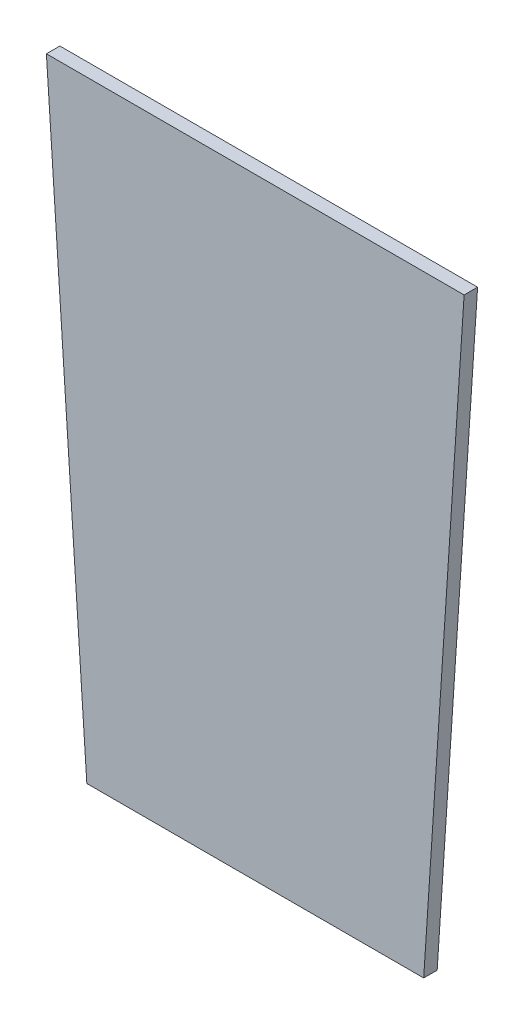
ISO-10303-21;
HEADER;
FILE_DESCRIPTION(('STEP AP214'),'2;1');
FILE_NAME('part.step','',(''),(''),'','','');
FILE_SCHEMA(('AUTOMOTIVE_DESIGN { 1 0 10303 214 1 1 1 1 }'));
ENDSEC;
DATA;
#1=APPLICATION_CONTEXT('core data for automotive mechanical design processes');
#2=APPLICATION_PROTOCOL_DEFINITION('international standard','automotive_design',2000,#1);
#3=PRODUCT_CONTEXT('',#1,'mechanical');
#4=PRODUCT('Part','Part','',(#3));
#5=PRODUCT_RELATED_PRODUCT_CATEGORY('part','',(#4));
#6=PRODUCT_DEFINITION_FORMATION('','',#4);
#7=PRODUCT_DEFINITION_CONTEXT('part definition',#1,'design');
#8=PRODUCT_DEFINITION('design','',#6,#7);
#9=PRODUCT_DEFINITION_SHAPE('','',#8);
#10=(LENGTH_UNIT() NAMED_UNIT(*) SI_UNIT(.MILLI.,.METRE.));
#11=(NAMED_UNIT(*) PLANE_ANGLE_UNIT() SI_UNIT($,.RADIAN.));
#12=(NAMED_UNIT(*) SI_UNIT($,.STERADIAN.) SOLID_ANGLE_UNIT());
#13=UNCERTAINTY_MEASURE_WITH_UNIT(LENGTH_MEASURE(1.E-05),#10,'distance_accuracy_value','');
#14=(GEOMETRIC_REPRESENTATION_CONTEXT(3) GLOBAL_UNCERTAINTY_ASSIGNED_CONTEXT((#13)) GLOBAL_UNIT_ASSIGNED_CONTEXT((#10,
#11,#12)) REPRESENTATION_CONTEXT('',''));
#15=CARTESIAN_POINT('',(0.,0.,0.));
#16=DIRECTION('',(0.,0.,1.));
#17=DIRECTION('',(1.,0.,0.));
#18=AXIS2_PLACEMENT_3D('',#15,#16,#17);
#19=CARTESIAN_POINT('',(-125.,-227.004955893038,10.));
#20=DIRECTION('',(0.997823981947419,0.0659340659340659,0.));
#21=DIRECTION('',(-0.0659340659340659,0.997823981947419,0.));
#22=AXIS2_PLACEMENT_3D('',#19,#20,#21);
#23=PLANE('',#22);
#24=DIRECTION('',(0.0659340659340659,-0.997823981947419,0.));
#25=VECTOR('',#24,1.);
#26=CARTESIAN_POINT('',(-125.,-227.004955893038,0.));
#27=LINE('',#26,#25);
#28=CARTESIAN_POINT('',(-155.,227.004955893038,0.));
#29=VERTEX_POINT('',#28);
#30=CARTESIAN_POINT('',(-125.,-227.004955893038,0.));
#31=VERTEX_POINT('',#30);
#32=EDGE_CURVE('E119',#29,#31,#27,.T.);
#33=ORIENTED_EDGE('',*,*,#32,.T.);
#34=DIRECTION('',(0.,0.,-1.));
#35=VECTOR('',#34,1.);
#36=CARTESIAN_POINT('',(-125.,-227.004955893038,10.));
#37=LINE('',#36,#35);
#38=CARTESIAN_POINT('',(-125.,-227.004955893038,10.));
#39=VERTEX_POINT('',#38);
#40=EDGE_CURVE('E11',#39,#31,#37,.T.);
#41=ORIENTED_EDGE('',*,*,#40,.F.);
#42=DIRECTION('',(0.0659340659340659,-0.997823981947419,0.));
#43=VECTOR('',#42,1.);
#44=CARTESIAN_POINT('',(-125.,-227.004955893038,10.));
#45=LINE('',#44,#43);
#46=CARTESIAN_POINT('',(-155.,227.004955893038,10.));
#47=VERTEX_POINT('',#46);
#48=EDGE_CURVE('E102',#47,#39,#45,.T.);
#49=ORIENTED_EDGE('',*,*,#48,.F.);
#50=DIRECTION('',(0.,0.,-1.));
#51=VECTOR('',#50,1.);
#52=CARTESIAN_POINT('',(-155.,227.004955893038,10.));
#53=LINE('',#52,#51);
#54=EDGE_CURVE('E115',#47,#29,#53,.T.);
#55=ORIENTED_EDGE('',*,*,#54,.T.);
#56=EDGE_LOOP('',(#33,#41,#49,#55));
#57=FACE_BOUND('',#56,.T.);
#58=ADVANCED_FACE('F47',(#57),#23,.F.);
#59=CARTESIAN_POINT('',(125.,-227.004955893038,10.));
#60=DIRECTION('',(0.,1.,0.));
#61=DIRECTION('',(0.,0.,1.));
#62=AXIS2_PLACEMENT_3D('',#59,#60,#61);
#63=PLANE('',#62);
#64=DIRECTION('',(1.,0.,0.));
#65=VECTOR('',#64,1.);
#66=CARTESIAN_POINT('',(125.,-227.004955893038,0.));
#67=LINE('',#66,#65);
#68=CARTESIAN_POINT('',(125.,-227.004955893038,0.));
#69=VERTEX_POINT('',#68);
#70=EDGE_CURVE('E107',#31,#69,#67,.T.);
#71=ORIENTED_EDGE('',*,*,#70,.T.);
#72=DIRECTION('',(0.,0.,-1.));
#73=VECTOR('',#72,1.);
#74=CARTESIAN_POINT('',(125.,-227.004955893038,10.));
#75=LINE('',#74,#73);
#76=CARTESIAN_POINT('',(125.,-227.004955893038,10.));
#77=VERTEX_POINT('',#76);
#78=EDGE_CURVE('E55',#77,#69,#75,.T.);
#79=ORIENTED_EDGE('',*,*,#78,.F.);
#80=DIRECTION('',(1.,0.,0.));
#81=VECTOR('',#80,1.);
#82=CARTESIAN_POINT('',(125.,-227.004955893038,10.));
#83=LINE('',#82,#81);
#84=EDGE_CURVE('E97',#39,#77,#83,.T.);
#85=ORIENTED_EDGE('',*,*,#84,.F.);
#86=ORIENTED_EDGE('',*,*,#40,.T.);
#87=EDGE_LOOP('',(#71,#79,#85,#86));
#88=FACE_BOUND('',#87,.T.);
#89=ADVANCED_FACE('F106',(#88),#63,.F.);
#90=CARTESIAN_POINT('',(155.,227.004955893038,10.));
#91=DIRECTION('',(-0.997823981947419,0.0659340659340659,0.));
#92=DIRECTION('',(-0.0659340659340659,-0.997823981947419,0.));
#93=AXIS2_PLACEMENT_3D('',#90,#91,#92);
#94=PLANE('',#93);
#95=DIRECTION('',(0.0659340659340659,0.997823981947419,0.));
#96=VECTOR('',#95,1.);
#97=CARTESIAN_POINT('',(155.,227.004955893038,0.));
#98=LINE('',#97,#96);
#99=CARTESIAN_POINT('',(155.,227.004955893038,0.));
#100=VERTEX_POINT('',#99);
#101=EDGE_CURVE('E83',#69,#100,#98,.T.);
#102=ORIENTED_EDGE('',*,*,#101,.T.);
#103=DIRECTION('',(0.,0.,-1.));
#104=VECTOR('',#103,1.);
#105=CARTESIAN_POINT('',(155.,227.004955893038,10.));
#106=LINE('',#105,#104);
#107=CARTESIAN_POINT('',(155.,227.004955893038,10.));
#108=VERTEX_POINT('',#107);
#109=EDGE_CURVE('E109',#108,#100,#106,.T.);
#110=ORIENTED_EDGE('',*,*,#109,.F.);
#111=DIRECTION('',(0.0659340659340659,0.997823981947419,0.));
#112=VECTOR('',#111,1.);
#113=CARTESIAN_POINT('',(155.,227.004955893038,10.));
#114=LINE('',#113,#112);
#115=EDGE_CURVE('E100',#77,#108,#114,.T.);
#116=ORIENTED_EDGE('',*,*,#115,.F.);
#117=ORIENTED_EDGE('',*,*,#78,.T.);
#118=EDGE_LOOP('',(#102,#110,#116,#117));
#119=FACE_BOUND('',#118,.T.);
#120=ADVANCED_FACE('F110',(#119),#94,.F.);
#121=CARTESIAN_POINT('',(-155.,227.004955893038,10.));
#122=DIRECTION('',(0.,-1.,0.));
#123=DIRECTION('',(0.,0.,-1.));
#124=AXIS2_PLACEMENT_3D('',#121,#122,#123);
#125=PLANE('',#124);
#126=DIRECTION('',(-1.,0.,0.));
#127=VECTOR('',#126,1.);
#128=CARTESIAN_POINT('',(-155.,227.004955893038,0.));
#129=LINE('',#128,#127);
#130=EDGE_CURVE('E90',#100,#29,#129,.T.);
#131=ORIENTED_EDGE('',*,*,#130,.T.);
#132=ORIENTED_EDGE('',*,*,#54,.F.);
#133=DIRECTION('',(-1.,0.,0.));
#134=VECTOR('',#133,1.);
#135=CARTESIAN_POINT('',(-155.,227.004955893038,10.));
#136=LINE('',#135,#134);
#137=EDGE_CURVE('E66',#108,#47,#136,.T.);
#138=ORIENTED_EDGE('',*,*,#137,.F.);
#139=ORIENTED_EDGE('',*,*,#109,.T.);
#140=EDGE_LOOP('',(#131,#132,#138,#139));
#141=FACE_BOUND('',#140,.T.);
#142=ADVANCED_FACE('F130',(#141),#125,.F.);
#143=CARTESIAN_POINT('',(0.,0.,10.));
#144=DIRECTION('',(0.,0.,-1.));
#145=DIRECTION('',(-1.,0.,0.));
#146=AXIS2_PLACEMENT_3D('',#143,#144,#145);
#147=PLANE('',#146);
#148=ORIENTED_EDGE('',*,*,#48,.T.);
#149=ORIENTED_EDGE('',*,*,#84,.T.);
#150=ORIENTED_EDGE('',*,*,#115,.T.);
#151=ORIENTED_EDGE('',*,*,#137,.T.);
#152=EDGE_LOOP('',(#148,#149,#150,#151));
#153=FACE_BOUND('',#152,.T.);
#154=ADVANCED_FACE('F98',(#153),#147,.F.);
#155=CARTESIAN_POINT('',(0.,0.,0.));
#156=DIRECTION('',(0.,0.,-1.));
#157=DIRECTION('',(-1.,0.,0.));
#158=AXIS2_PLACEMENT_3D('',#155,#156,#157);
#159=PLANE('',#158);
#160=ORIENTED_EDGE('',*,*,#32,.F.);
#161=ORIENTED_EDGE('',*,*,#130,.F.);
#162=ORIENTED_EDGE('',*,*,#101,.F.);
#163=ORIENTED_EDGE('',*,*,#70,.F.);
#164=EDGE_LOOP('',(#160,#161,#162,#163));
#165=FACE_BOUND('',#164,.T.);
#166=ADVANCED_FACE('F133',(#165),#159,.T.);
#167=CLOSED_SHELL('',(#58,#89,#120,#142,#154,#166));
#168=MANIFOLD_SOLID_BREP('B2',#167);
#169=ADVANCED_BREP_SHAPE_REPRESENTATION('',(#18,#168),#14);
#170=SHAPE_DEFINITION_REPRESENTATION(#9,#169);
ENDSEC;
END-ISO-10303-21;
